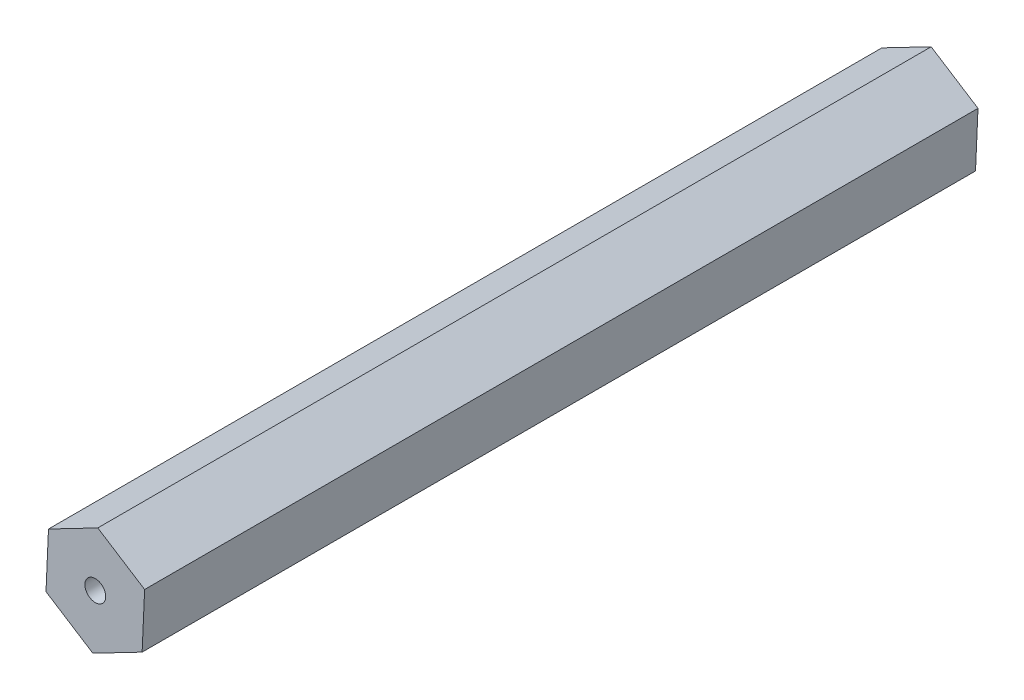
ISO-10303-21;
HEADER;
FILE_DESCRIPTION(('STEP AP214'),'2;1');
FILE_NAME('part.step','',(''),(''),'','','');
FILE_SCHEMA(('AUTOMOTIVE_DESIGN { 1 0 10303 214 1 1 1 1 }'));
ENDSEC;
DATA;
#1=APPLICATION_CONTEXT('core data for automotive mechanical design processes');
#2=APPLICATION_PROTOCOL_DEFINITION('international standard','automotive_design',2000,#1);
#3=PRODUCT_CONTEXT('',#1,'mechanical');
#4=PRODUCT('Part','Part','',(#3));
#5=PRODUCT_RELATED_PRODUCT_CATEGORY('part','',(#4));
#6=PRODUCT_DEFINITION_FORMATION('','',#4);
#7=PRODUCT_DEFINITION_CONTEXT('part definition',#1,'design');
#8=PRODUCT_DEFINITION('design','',#6,#7);
#9=PRODUCT_DEFINITION_SHAPE('','',#8);
#10=(LENGTH_UNIT() NAMED_UNIT(*) SI_UNIT(.MILLI.,.METRE.));
#11=(NAMED_UNIT(*) PLANE_ANGLE_UNIT() SI_UNIT($,.RADIAN.));
#12=(NAMED_UNIT(*) SI_UNIT($,.STERADIAN.) SOLID_ANGLE_UNIT());
#13=UNCERTAINTY_MEASURE_WITH_UNIT(LENGTH_MEASURE(1.E-05),#10,'distance_accuracy_value','');
#14=(GEOMETRIC_REPRESENTATION_CONTEXT(3) GLOBAL_UNCERTAINTY_ASSIGNED_CONTEXT((#13)) GLOBAL_UNIT_ASSIGNED_CONTEXT((#10,
#11,#12)) REPRESENTATION_CONTEXT('',''));
#15=CARTESIAN_POINT('',(0.,0.,0.));
#16=DIRECTION('',(0.,0.,1.));
#17=DIRECTION('',(1.,0.,0.));
#18=AXIS2_PLACEMENT_3D('',#15,#16,#17);
#19=CARTESIAN_POINT('',(-0.178785735264127,-3.99600246006757,60.));
#20=DIRECTION('',(-0.460792060365193,0.887508127908923,0.));
#21=DIRECTION('',(-0.887508127908923,-0.460792060365193,0.));
#22=AXIS2_PLACEMENT_3D('',#19,#20,#21);
#23=PLANE('',#22);
#24=DIRECTION('',(0.887508127908923,0.460792060365193,0.));
#25=VECTOR('',#24,1.);
#26=CARTESIAN_POINT('',(-0.178785735264127,-3.99600246006757,0.));
#27=LINE('',#26,#25);
#28=CARTESIAN_POINT('',(-0.178785735264127,-3.99600246006757,0.));
#29=VERTEX_POINT('',#28);
#30=CARTESIAN_POINT('',(3.37124677637156,-2.1528342186068,0.));
#31=VERTEX_POINT('',#30);
#32=EDGE_CURVE('E118',#29,#31,#27,.T.);
#33=ORIENTED_EDGE('',*,*,#32,.T.);
#34=DIRECTION('',(0.,0.,-1.));
#35=VECTOR('',#34,1.);
#36=CARTESIAN_POINT('',(3.37124677637156,-2.1528342186068,60.));
#37=LINE('',#36,#35);
#38=CARTESIAN_POINT('',(3.37124677637156,-2.1528342186068,60.));
#39=VERTEX_POINT('',#38);
#40=EDGE_CURVE('E11',#39,#31,#37,.T.);
#41=ORIENTED_EDGE('',*,*,#40,.F.);
#42=DIRECTION('',(0.887508127908923,0.460792060365193,0.));
#43=VECTOR('',#42,1.);
#44=CARTESIAN_POINT('',(-0.178785735264127,-3.99600246006757,60.));
#45=LINE('',#44,#43);
#46=CARTESIAN_POINT('',(-0.178785735264127,-3.99600246006757,60.));
#47=VERTEX_POINT('',#46);
#48=EDGE_CURVE('E129',#47,#39,#45,.T.);
#49=ORIENTED_EDGE('',*,*,#48,.F.);
#50=DIRECTION('',(0.,0.,-1.));
#51=VECTOR('',#50,1.);
#52=CARTESIAN_POINT('',(-0.178785735264127,-3.99600246006757,60.));
#53=LINE('',#52,#51);
#54=EDGE_CURVE('E114',#47,#29,#53,.T.);
#55=ORIENTED_EDGE('',*,*,#54,.T.);
#56=EDGE_LOOP('',(#33,#41,#49,#55));
#57=FACE_BOUND('',#56,.T.);
#58=ADVANCED_FACE('F34',(#57),#23,.F.);
#59=CARTESIAN_POINT('',(3.37124677637156,-2.1528342186068,60.));
#60=DIRECTION('',(-0.999000615016892,0.0446964338160318,0.));
#61=DIRECTION('',(-0.0446964338160318,-0.999000615016893,0.));
#62=AXIS2_PLACEMENT_3D('',#59,#60,#61);
#63=PLANE('',#62);
#64=DIRECTION('',(0.0446964338160318,0.999000615016892,0.));
#65=VECTOR('',#64,1.);
#66=CARTESIAN_POINT('',(3.37124677637156,-2.1528342186068,0.));
#67=LINE('',#66,#65);
#68=CARTESIAN_POINT('',(3.55003251163569,1.84316824146077,0.));
#69=VERTEX_POINT('',#68);
#70=EDGE_CURVE('E121',#31,#69,#67,.T.);
#71=ORIENTED_EDGE('',*,*,#70,.T.);
#72=DIRECTION('',(0.,0.,-1.));
#73=VECTOR('',#72,1.);
#74=CARTESIAN_POINT('',(3.55003251163569,1.84316824146077,60.));
#75=LINE('',#74,#73);
#76=CARTESIAN_POINT('',(3.55003251163569,1.84316824146077,60.));
#77=VERTEX_POINT('',#76);
#78=EDGE_CURVE('E42',#77,#69,#75,.T.);
#79=ORIENTED_EDGE('',*,*,#78,.F.);
#80=DIRECTION('',(0.0446964338160318,0.999000615016892,0.));
#81=VECTOR('',#80,1.);
#82=CARTESIAN_POINT('',(3.37124677637156,-2.1528342186068,60.));
#83=LINE('',#82,#81);
#84=EDGE_CURVE('E87',#39,#77,#83,.T.);
#85=ORIENTED_EDGE('',*,*,#84,.F.);
#86=ORIENTED_EDGE('',*,*,#40,.T.);
#87=EDGE_LOOP('',(#71,#79,#85,#86));
#88=FACE_BOUND('',#87,.T.);
#89=ADVANCED_FACE('F154',(#88),#63,.F.);
#90=CARTESIAN_POINT('',(3.55003251163569,1.84316824146077,60.));
#91=DIRECTION('',(-0.5382085546517,-0.842811694092891,0.));
#92=DIRECTION('',(0.842811694092891,-0.5382085546517,0.));
#93=AXIS2_PLACEMENT_3D('',#90,#91,#92);
#94=PLANE('',#93);
#95=DIRECTION('',(-0.842811694092891,0.5382085546517,0.));
#96=VECTOR('',#95,1.);
#97=CARTESIAN_POINT('',(3.55003251163569,1.84316824146077,0.));
#98=LINE('',#97,#96);
#99=CARTESIAN_POINT('',(0.178785735264129,3.99600246006757,0.));
#100=VERTEX_POINT('',#99);
#101=EDGE_CURVE('E124',#69,#100,#98,.T.);
#102=ORIENTED_EDGE('',*,*,#101,.T.);
#103=DIRECTION('',(0.,0.,-1.));
#104=VECTOR('',#103,1.);
#105=CARTESIAN_POINT('',(0.178785735264129,3.99600246006757,60.));
#106=LINE('',#105,#104);
#107=CARTESIAN_POINT('',(0.178785735264129,3.99600246006757,60.));
#108=VERTEX_POINT('',#107);
#109=EDGE_CURVE('E109',#108,#100,#106,.T.);
#110=ORIENTED_EDGE('',*,*,#109,.F.);
#111=DIRECTION('',(-0.842811694092891,0.5382085546517,0.));
#112=VECTOR('',#111,1.);
#113=CARTESIAN_POINT('',(3.55003251163569,1.84316824146077,60.));
#114=LINE('',#113,#112);
#115=EDGE_CURVE('E100',#77,#108,#114,.T.);
#116=ORIENTED_EDGE('',*,*,#115,.F.);
#117=ORIENTED_EDGE('',*,*,#78,.T.);
#118=EDGE_LOOP('',(#102,#110,#116,#117));
#119=FACE_BOUND('',#118,.T.);
#120=ADVANCED_FACE('F135',(#119),#94,.F.);
#121=CARTESIAN_POINT('',(0.178785735264129,3.99600246006757,60.));
#122=DIRECTION('',(0.460792060365192,-0.887508127908923,0.));
#123=DIRECTION('',(0.887508127908923,0.460792060365192,0.));
#124=AXIS2_PLACEMENT_3D('',#121,#122,#123);
#125=PLANE('',#124);
#126=DIRECTION('',(-0.887508127908923,-0.460792060365192,0.));
#127=VECTOR('',#126,1.);
#128=CARTESIAN_POINT('',(0.178785735264129,3.99600246006757,0.));
#129=LINE('',#128,#127);
#130=CARTESIAN_POINT('',(-3.37124677637156,2.1528342186068,0.));
#131=VERTEX_POINT('',#130);
#132=EDGE_CURVE('E108',#100,#131,#129,.T.);
#133=ORIENTED_EDGE('',*,*,#132,.T.);
#134=DIRECTION('',(0.,0.,-1.));
#135=VECTOR('',#134,1.);
#136=CARTESIAN_POINT('',(-3.37124677637156,2.1528342186068,60.));
#137=LINE('',#136,#135);
#138=CARTESIAN_POINT('',(-3.37124677637156,2.1528342186068,60.));
#139=VERTEX_POINT('',#138);
#140=EDGE_CURVE('E105',#139,#131,#137,.T.);
#141=ORIENTED_EDGE('',*,*,#140,.F.);
#142=DIRECTION('',(-0.887508127908923,-0.460792060365192,0.));
#143=VECTOR('',#142,1.);
#144=CARTESIAN_POINT('',(0.178785735264129,3.99600246006757,60.));
#145=LINE('',#144,#143);
#146=EDGE_CURVE('E94',#108,#139,#145,.T.);
#147=ORIENTED_EDGE('',*,*,#146,.F.);
#148=ORIENTED_EDGE('',*,*,#109,.T.);
#149=EDGE_LOOP('',(#133,#141,#147,#148));
#150=FACE_BOUND('',#149,.T.);
#151=ADVANCED_FACE('F106',(#150),#125,.F.);
#152=CARTESIAN_POINT('',(-3.37124677637156,2.1528342186068,60.));
#153=DIRECTION('',(0.999000615016892,-0.0446964338160321,0.));
#154=DIRECTION('',(0.0446964338160321,0.999000615016892,0.));
#155=AXIS2_PLACEMENT_3D('',#152,#153,#154);
#156=PLANE('',#155);
#157=DIRECTION('',(-0.0446964338160321,-0.999000615016892,0.));
#158=VECTOR('',#157,1.);
#159=CARTESIAN_POINT('',(-3.37124677637156,2.1528342186068,0.));
#160=LINE('',#159,#158);
#161=CARTESIAN_POINT('',(-3.55003251163569,-1.84316824146077,0.));
#162=VERTEX_POINT('',#161);
#163=EDGE_CURVE('E73',#131,#162,#160,.T.);
#164=ORIENTED_EDGE('',*,*,#163,.T.);
#165=DIRECTION('',(0.,0.,-1.));
#166=VECTOR('',#165,1.);
#167=CARTESIAN_POINT('',(-3.55003251163569,-1.84316824146077,60.));
#168=LINE('',#167,#166);
#169=CARTESIAN_POINT('',(-3.55003251163569,-1.84316824146077,60.));
#170=VERTEX_POINT('',#169);
#171=EDGE_CURVE('E110',#170,#162,#168,.T.);
#172=ORIENTED_EDGE('',*,*,#171,.F.);
#173=DIRECTION('',(-0.0446964338160321,-0.999000615016892,0.));
#174=VECTOR('',#173,1.);
#175=CARTESIAN_POINT('',(-3.37124677637156,2.1528342186068,60.));
#176=LINE('',#175,#174);
#177=EDGE_CURVE('E98',#139,#170,#176,.T.);
#178=ORIENTED_EDGE('',*,*,#177,.F.);
#179=ORIENTED_EDGE('',*,*,#140,.T.);
#180=EDGE_LOOP('',(#164,#172,#178,#179));
#181=FACE_BOUND('',#180,.T.);
#182=ADVANCED_FACE('F112',(#181),#156,.F.);
#183=CARTESIAN_POINT('',(-3.55003251163569,-1.84316824146077,60.));
#184=DIRECTION('',(0.5382085546517,0.842811694092891,0.));
#185=DIRECTION('',(-0.842811694092891,0.5382085546517,0.));
#186=AXIS2_PLACEMENT_3D('',#183,#184,#185);
#187=PLANE('',#186);
#188=DIRECTION('',(0.842811694092891,-0.5382085546517,0.));
#189=VECTOR('',#188,1.);
#190=CARTESIAN_POINT('',(-3.55003251163569,-1.84316824146077,0.));
#191=LINE('',#190,#189);
#192=EDGE_CURVE('E79',#162,#29,#191,.T.);
#193=ORIENTED_EDGE('',*,*,#192,.T.);
#194=ORIENTED_EDGE('',*,*,#54,.F.);
#195=DIRECTION('',(0.842811694092891,-0.5382085546517,0.));
#196=VECTOR('',#195,1.);
#197=CARTESIAN_POINT('',(-3.55003251163569,-1.84316824146077,60.));
#198=LINE('',#197,#196);
#199=EDGE_CURVE('E50',#170,#47,#198,.T.);
#200=ORIENTED_EDGE('',*,*,#199,.F.);
#201=ORIENTED_EDGE('',*,*,#171,.T.);
#202=EDGE_LOOP('',(#193,#194,#200,#201));
#203=FACE_BOUND('',#202,.T.);
#204=ADVANCED_FACE('F142',(#203),#187,.F.);
#205=CARTESIAN_POINT('',(0.,0.,60.));
#206=DIRECTION('',(0.,0.,1.));
#207=DIRECTION('',(1.,0.,0.));
#208=AXIS2_PLACEMENT_3D('',#205,#206,#207);
#209=PLANE('',#208);
#210=CARTESIAN_POINT('',(0.,0.,60.));
#211=DIRECTION('',(0.,0.,1.));
#212=DIRECTION('',(1.,0.,0.));
#213=AXIS2_PLACEMENT_3D('',#210,#211,#212);
#214=CIRCLE('',#213,0.75);
#215=CARTESIAN_POINT('',(0.75,0.,60.));
#216=VERTEX_POINT('',#215);
#217=EDGE_CURVE('E237',#216,#216,#214,.T.);
#218=ORIENTED_EDGE('',*,*,#217,.F.);
#219=EDGE_LOOP('',(#218));
#220=FACE_BOUND('',#219,.T.);
#221=ORIENTED_EDGE('',*,*,#48,.T.);
#222=ORIENTED_EDGE('',*,*,#84,.T.);
#223=ORIENTED_EDGE('',*,*,#115,.T.);
#224=ORIENTED_EDGE('',*,*,#146,.T.);
#225=ORIENTED_EDGE('',*,*,#177,.T.);
#226=ORIENTED_EDGE('',*,*,#199,.T.);
#227=EDGE_LOOP('',(#221,#222,#223,#224,#225,#226));
#228=FACE_BOUND('',#227,.T.);
#229=ADVANCED_FACE('F96',(#220,#228),#209,.T.);
#230=CARTESIAN_POINT('',(0.,0.,0.));
#231=DIRECTION('',(0.,0.,1.));
#232=DIRECTION('',(1.,0.,0.));
#233=AXIS2_PLACEMENT_3D('',#230,#231,#232);
#234=PLANE('',#233);
#235=CARTESIAN_POINT('',(0.,0.,0.));
#236=DIRECTION('',(0.,0.,-1.));
#237=DIRECTION('',(-1.,0.,0.));
#238=AXIS2_PLACEMENT_3D('',#235,#236,#237);
#239=CIRCLE('',#238,0.75);
#240=CARTESIAN_POINT('',(-0.75,0.,0.));
#241=VERTEX_POINT('',#240);
#242=EDGE_CURVE('E238',#241,#241,#239,.T.);
#243=ORIENTED_EDGE('',*,*,#242,.F.);
#244=EDGE_LOOP('',(#243));
#245=FACE_BOUND('',#244,.T.);
#246=ORIENTED_EDGE('',*,*,#32,.F.);
#247=ORIENTED_EDGE('',*,*,#192,.F.);
#248=ORIENTED_EDGE('',*,*,#163,.F.);
#249=ORIENTED_EDGE('',*,*,#132,.F.);
#250=ORIENTED_EDGE('',*,*,#101,.F.);
#251=ORIENTED_EDGE('',*,*,#70,.F.);
#252=EDGE_LOOP('',(#246,#247,#248,#249,#250,#251));
#253=FACE_BOUND('',#252,.T.);
#254=ADVANCED_FACE('F138',(#245,#253),#234,.F.);
#255=CARTESIAN_POINT('',(0.,0.,55.));
#256=DIRECTION('',(0.,0.,1.));
#257=DIRECTION('',(1.,0.,0.));
#258=AXIS2_PLACEMENT_3D('',#255,#256,#257);
#259=CYLINDRICAL_SURFACE('',#258,0.75);
#260=CARTESIAN_POINT('',(0.,0.,55.));
#261=DIRECTION('',(0.,0.,1.));
#262=DIRECTION('',(1.,0.,0.));
#263=AXIS2_PLACEMENT_3D('',#260,#261,#262);
#264=CIRCLE('',#263,0.75);
#265=CARTESIAN_POINT('',(0.75,0.,55.));
#266=VERTEX_POINT('',#265);
#267=EDGE_CURVE('E122',#266,#266,#264,.T.);
#268=ORIENTED_EDGE('',*,*,#267,.F.);
#269=EDGE_LOOP('',(#268));
#270=FACE_BOUND('',#269,.T.);
#271=ORIENTED_EDGE('',*,*,#217,.T.);
#272=EDGE_LOOP('',(#271));
#273=FACE_BOUND('',#272,.T.);
#274=ADVANCED_FACE('F189',(#270,#273),#259,.F.);
#275=CARTESIAN_POINT('',(0.,0.,55.));
#276=DIRECTION('',(0.,0.,1.));
#277=DIRECTION('',(1.,0.,0.));
#278=AXIS2_PLACEMENT_3D('',#275,#276,#277);
#279=PLANE('',#278);
#280=ORIENTED_EDGE('',*,*,#267,.T.);
#281=EDGE_LOOP('',(#280));
#282=FACE_BOUND('',#281,.T.);
#283=ADVANCED_FACE('F194',(#282),#279,.T.);
#284=CARTESIAN_POINT('',(0.,0.,5.));
#285=DIRECTION('',(0.,0.,-1.));
#286=DIRECTION('',(-1.,0.,0.));
#287=AXIS2_PLACEMENT_3D('',#284,#285,#286);
#288=CYLINDRICAL_SURFACE('',#287,0.75);
#289=CARTESIAN_POINT('',(0.,0.,5.));
#290=DIRECTION('',(0.,0.,-1.));
#291=DIRECTION('',(-1.,0.,0.));
#292=AXIS2_PLACEMENT_3D('',#289,#290,#291);
#293=CIRCLE('',#292,0.75);
#294=CARTESIAN_POINT('',(-0.75,0.,5.));
#295=VERTEX_POINT('',#294);
#296=EDGE_CURVE('E236',#295,#295,#293,.T.);
#297=ORIENTED_EDGE('',*,*,#296,.F.);
#298=EDGE_LOOP('',(#297));
#299=FACE_BOUND('',#298,.T.);
#300=ORIENTED_EDGE('',*,*,#242,.T.);
#301=EDGE_LOOP('',(#300));
#302=FACE_BOUND('',#301,.T.);
#303=ADVANCED_FACE('F204',(#299,#302),#288,.F.);
#304=CARTESIAN_POINT('',(0.,0.,5.));
#305=DIRECTION('',(0.,0.,-1.));
#306=DIRECTION('',(-1.,0.,0.));
#307=AXIS2_PLACEMENT_3D('',#304,#305,#306);
#308=PLANE('',#307);
#309=ORIENTED_EDGE('',*,*,#296,.T.);
#310=EDGE_LOOP('',(#309));
#311=FACE_BOUND('',#310,.T.);
#312=ADVANCED_FACE('F220',(#311),#308,.T.);
#313=CLOSED_SHELL('',(#58,#89,#120,#151,#182,#204,#229,#254,#274,#283,#303,#312));
#314=MANIFOLD_SOLID_BREP('B2',#313);
#315=ADVANCED_BREP_SHAPE_REPRESENTATION('',(#18,#314),#14);
#316=SHAPE_DEFINITION_REPRESENTATION(#9,#315);
ENDSEC;
END-ISO-10303-21;
